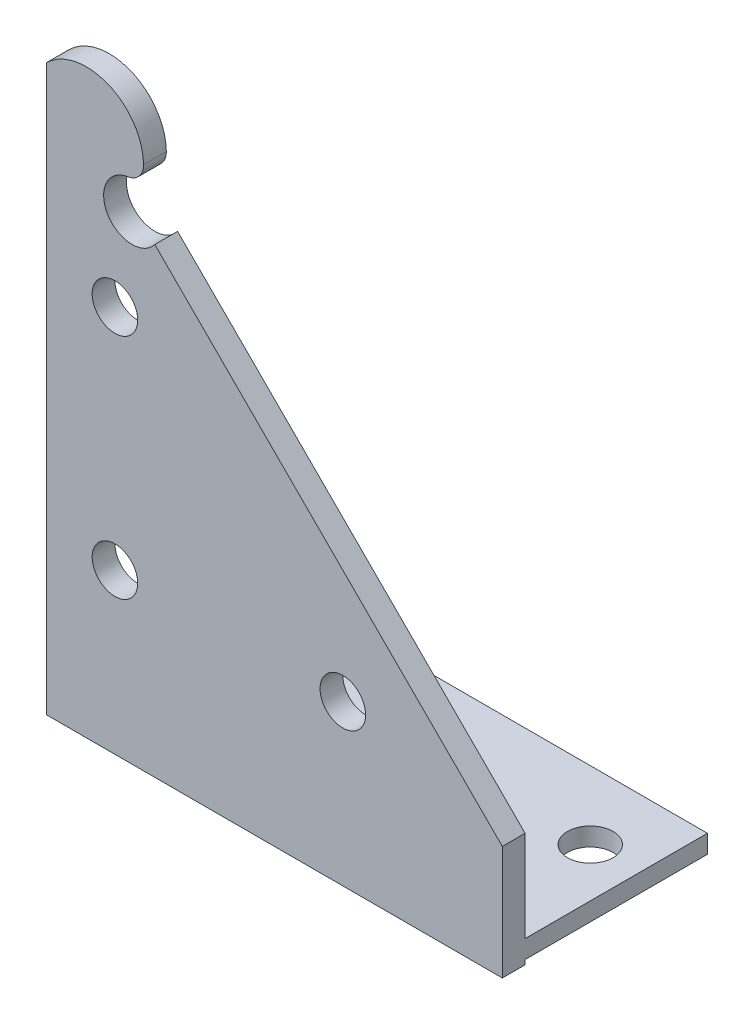
ISO-10303-21;
HEADER;
FILE_DESCRIPTION(('STEP AP214'),'2;1');
FILE_NAME('part.step','',(''),(''),'','','');
FILE_SCHEMA(('AUTOMOTIVE_DESIGN { 1 0 10303 214 1 1 1 1 }'));
ENDSEC;
DATA;
#1=APPLICATION_CONTEXT('core data for automotive mechanical design processes');
#2=APPLICATION_PROTOCOL_DEFINITION('international standard','automotive_design',2000,#1);
#3=PRODUCT_CONTEXT('',#1,'mechanical');
#4=PRODUCT('Part','Part','',(#3));
#5=PRODUCT_RELATED_PRODUCT_CATEGORY('part','',(#4));
#6=PRODUCT_DEFINITION_FORMATION('','',#4);
#7=PRODUCT_DEFINITION_CONTEXT('part definition',#1,'design');
#8=PRODUCT_DEFINITION('design','',#6,#7);
#9=PRODUCT_DEFINITION_SHAPE('','',#8);
#10=(LENGTH_UNIT() NAMED_UNIT(*) SI_UNIT(.MILLI.,.METRE.));
#11=(NAMED_UNIT(*) PLANE_ANGLE_UNIT() SI_UNIT($,.RADIAN.));
#12=(NAMED_UNIT(*) SI_UNIT($,.STERADIAN.) SOLID_ANGLE_UNIT());
#13=UNCERTAINTY_MEASURE_WITH_UNIT(LENGTH_MEASURE(1.E-05),#10,'distance_accuracy_value','');
#14=(GEOMETRIC_REPRESENTATION_CONTEXT(3) GLOBAL_UNCERTAINTY_ASSIGNED_CONTEXT((#13)) GLOBAL_UNIT_ASSIGNED_CONTEXT((#10,
#11,#12)) REPRESENTATION_CONTEXT('',''));
#15=CARTESIAN_POINT('',(0.,0.,0.));
#16=DIRECTION('',(0.,0.,1.));
#17=DIRECTION('',(1.,0.,0.));
#18=AXIS2_PLACEMENT_3D('',#15,#16,#17);
#19=CARTESIAN_POINT('',(11.9126,66.675,0.));
#20=DIRECTION('',(0.,0.,1.));
#21=DIRECTION('',(1.,0.,0.));
#22=AXIS2_PLACEMENT_3D('',#19,#20,#21);
#23=PLANE('',#22);
#24=DIRECTION('',(-1.,0.,0.));
#25=VECTOR('',#24,1.);
#26=CARTESIAN_POINT('',(63.5,0.635,0.));
#27=LINE('',#26,#25);
#28=CARTESIAN_POINT('',(63.5,0.635,0.));
#29=VERTEX_POINT('',#28);
#30=CARTESIAN_POINT('',(0.,0.634999999999997,0.));
#31=VERTEX_POINT('',#30);
#32=EDGE_CURVE('E195',#29,#31,#27,.T.);
#33=ORIENTED_EDGE('',*,*,#32,.F.);
#34=DIRECTION('',(0.,1.,0.));
#35=VECTOR('',#34,1.);
#36=CARTESIAN_POINT('',(63.5,0.,0.));
#37=LINE('',#36,#35);
#38=CARTESIAN_POINT('',(63.5,0.,0.));
#39=VERTEX_POINT('',#38);
#40=EDGE_CURVE('E157',#39,#29,#37,.T.);
#41=ORIENTED_EDGE('',*,*,#40,.F.);
#42=DIRECTION('',(1.,0.,0.));
#43=VECTOR('',#42,1.);
#44=CARTESIAN_POINT('',(0.,0.,0.));
#45=LINE('',#44,#43);
#46=CARTESIAN_POINT('',(0.,0.,0.));
#47=VERTEX_POINT('',#46);
#48=EDGE_CURVE('E152',#47,#39,#45,.T.);
#49=ORIENTED_EDGE('',*,*,#48,.F.);
#50=DIRECTION('',(0.,-1.,0.));
#51=VECTOR('',#50,1.);
#52=CARTESIAN_POINT('',(0.,78.7050670136892,0.));
#53=LINE('',#52,#51);
#54=EDGE_CURVE('E153',#31,#47,#53,.T.);
#55=ORIENTED_EDGE('',*,*,#54,.F.);
#56=EDGE_LOOP('',(#33,#41,#49,#55));
#57=FACE_BOUND('',#56,.T.);
#58=ADVANCED_FACE('F39',(#57),#23,.F.);
#59=CARTESIAN_POINT('',(11.9126,66.675,3.175));
#60=DIRECTION('',(0.,0.,1.));
#61=DIRECTION('',(1.,0.,0.));
#62=AXIS2_PLACEMENT_3D('',#59,#60,#61);
#63=PLANE('',#62);
#64=CARTESIAN_POINT('',(9.525,53.975,3.175));
#65=DIRECTION('',(0.,0.,1.));
#66=DIRECTION('',(1.,0.,0.));
#67=AXIS2_PLACEMENT_3D('',#64,#65,#66);
#68=CIRCLE('',#67,3.175);
#69=CARTESIAN_POINT('',(12.7,53.975,3.175));
#70=VERTEX_POINT('',#69);
#71=EDGE_CURVE('E239',#70,#70,#68,.T.);
#72=ORIENTED_EDGE('',*,*,#71,.F.);
#73=EDGE_LOOP('',(#72));
#74=FACE_BOUND('',#73,.T.);
#75=DIRECTION('',(0.,-1.,0.));
#76=VECTOR('',#75,1.);
#77=CARTESIAN_POINT('',(0.,78.7050670136892,3.175));
#78=LINE('',#77,#76);
#79=CARTESIAN_POINT('',(0.,78.7050670136892,3.175));
#80=VERTEX_POINT('',#79);
#81=CARTESIAN_POINT('',(0.,0.,3.175));
#82=VERTEX_POINT('',#81);
#83=EDGE_CURVE('E171',#80,#82,#78,.T.);
#84=ORIENTED_EDGE('',*,*,#83,.T.);
#85=DIRECTION('',(1.,0.,0.));
#86=VECTOR('',#85,1.);
#87=CARTESIAN_POINT('',(0.,0.,3.175));
#88=LINE('',#87,#86);
#89=CARTESIAN_POINT('',(63.5,0.,3.175));
#90=VERTEX_POINT('',#89);
#91=EDGE_CURVE('E102',#82,#90,#88,.T.);
#92=ORIENTED_EDGE('',*,*,#91,.T.);
#93=DIRECTION('',(0.,1.,0.));
#94=VECTOR('',#93,1.);
#95=CARTESIAN_POINT('',(63.5,0.,3.175));
#96=LINE('',#95,#94);
#97=CARTESIAN_POINT('',(63.5,15.875,3.175));
#98=VERTEX_POINT('',#97);
#99=EDGE_CURVE('E189',#90,#98,#96,.T.);
#100=ORIENTED_EDGE('',*,*,#99,.T.);
#101=DIRECTION('',(-0.707106781186549,0.707106781186546,0.));
#102=VECTOR('',#101,1.);
#103=CARTESIAN_POINT('',(63.5,15.875,3.175));
#104=LINE('',#103,#102);
#105=CARTESIAN_POINT('',(15.0803416705593,64.2946583294405,3.175));
#106=VERTEX_POINT('',#105);
#107=EDGE_CURVE('E123',#98,#106,#104,.T.);
#108=ORIENTED_EDGE('',*,*,#107,.T.);
#109=CARTESIAN_POINT('',(11.9126,66.675,3.175));
#110=DIRECTION('',(0.,0.,-1.));
#111=DIRECTION('',(1.,0.,0.));
#112=AXIS2_PLACEMENT_3D('',#109,#110,#111);
#113=CIRCLE('',#112,3.9624);
#114=CARTESIAN_POINT('',(11.3395116834637,70.5957376272138,3.175));
#115=VERTEX_POINT('',#114);
#116=EDGE_CURVE('E115',#106,#115,#113,.T.);
#117=ORIENTED_EDGE('',*,*,#116,.T.);
#118=CARTESIAN_POINT('',(10.9721473779918,73.1090309779918,3.175));
#119=DIRECTION('',(0.,0.,1.));
#120=DIRECTION('',(-1.,0.,0.));
#121=AXIS2_PLACEMENT_3D('',#118,#119,#120);
#122=CIRCLE('',#121,2.54);
#123=CARTESIAN_POINT('',(13.5118409826828,73.1484821413682,3.175));
#124=VERTEX_POINT('',#123);
#125=EDGE_CURVE('E120',#115,#124,#122,.T.);
#126=ORIENTED_EDGE('',*,*,#125,.T.);
#127=CARTESIAN_POINT('',(5.5626,73.025,3.175));
#128=DIRECTION('',(0.,0.,1.));
#129=DIRECTION('',(-1.,0.,0.));
#130=AXIS2_PLACEMENT_3D('',#127,#128,#129);
#131=CIRCLE('',#130,7.9502);
#132=EDGE_CURVE('E64',#124,#80,#131,.T.);
#133=ORIENTED_EDGE('',*,*,#132,.T.);
#134=EDGE_LOOP('',(#84,#92,#100,#108,#117,#126,#133));
#135=FACE_BOUND('',#134,.T.);
#136=CARTESIAN_POINT('',(9.525,22.225,3.175));
#137=DIRECTION('',(0.,0.,1.));
#138=DIRECTION('',(1.,0.,0.));
#139=AXIS2_PLACEMENT_3D('',#136,#137,#138);
#140=CIRCLE('',#139,3.175);
#141=CARTESIAN_POINT('',(12.7,22.225,3.175));
#142=VERTEX_POINT('',#141);
#143=EDGE_CURVE('E247',#142,#142,#140,.T.);
#144=ORIENTED_EDGE('',*,*,#143,.F.);
#145=EDGE_LOOP('',(#144));
#146=FACE_BOUND('',#145,.T.);
#147=CARTESIAN_POINT('',(41.275,22.225,3.175));
#148=DIRECTION('',(0.,0.,1.));
#149=DIRECTION('',(1.,0.,0.));
#150=AXIS2_PLACEMENT_3D('',#147,#148,#149);
#151=CIRCLE('',#150,3.175);
#152=CARTESIAN_POINT('',(44.45,22.225,3.175));
#153=VERTEX_POINT('',#152);
#154=EDGE_CURVE('E231',#153,#153,#151,.T.);
#155=ORIENTED_EDGE('',*,*,#154,.F.);
#156=EDGE_LOOP('',(#155));
#157=FACE_BOUND('',#156,.T.);
#158=ADVANCED_FACE('F117',(#74,#135,#146,#157),#63,.T.);
#159=CARTESIAN_POINT('',(63.5,3.175,0.));
#160=VERTEX_POINT('',#159);
#161=CARTESIAN_POINT('',(63.5,15.875,0.));
#162=VERTEX_POINT('',#161);
#163=EDGE_CURVE('E156',#160,#162,#37,.T.);
#164=ORIENTED_EDGE('',*,*,#163,.F.);
#165=DIRECTION('',(-1.,0.,0.));
#166=VECTOR('',#165,1.);
#167=CARTESIAN_POINT('',(63.5,3.175,0.));
#168=LINE('',#167,#166);
#169=CARTESIAN_POINT('',(0.,3.175,0.));
#170=VERTEX_POINT('',#169);
#171=EDGE_CURVE('E203',#160,#170,#168,.T.);
#172=ORIENTED_EDGE('',*,*,#171,.T.);
#173=CARTESIAN_POINT('',(0.,78.7050670136892,0.));
#174=VERTEX_POINT('',#173);
#175=EDGE_CURVE('E148',#174,#170,#53,.T.);
#176=ORIENTED_EDGE('',*,*,#175,.F.);
#177=CARTESIAN_POINT('',(5.5626,73.025,0.));
#178=DIRECTION('',(0.,0.,1.));
#179=DIRECTION('',(-1.,0.,0.));
#180=AXIS2_PLACEMENT_3D('',#177,#178,#179);
#181=CIRCLE('',#180,7.9502);
#182=CARTESIAN_POINT('',(13.5118409826828,73.1484821413682,0.));
#183=VERTEX_POINT('',#182);
#184=EDGE_CURVE('E94',#183,#174,#181,.T.);
#185=ORIENTED_EDGE('',*,*,#184,.F.);
#186=CARTESIAN_POINT('',(10.9721473779918,73.1090309779918,0.));
#187=DIRECTION('',(0.,0.,1.));
#188=DIRECTION('',(-1.,0.,0.));
#189=AXIS2_PLACEMENT_3D('',#186,#187,#188);
#190=CIRCLE('',#189,2.54);
#191=CARTESIAN_POINT('',(11.3395116834637,70.5957376272138,0.));
#192=VERTEX_POINT('',#191);
#193=EDGE_CURVE('E166',#192,#183,#190,.T.);
#194=ORIENTED_EDGE('',*,*,#193,.F.);
#195=CARTESIAN_POINT('',(11.9126,66.675,0.));
#196=DIRECTION('',(0.,0.,-1.));
#197=DIRECTION('',(1.,0.,0.));
#198=AXIS2_PLACEMENT_3D('',#195,#196,#197);
#199=CIRCLE('',#198,3.9624);
#200=CARTESIAN_POINT('',(15.0803416705593,64.2946583294405,0.));
#201=VERTEX_POINT('',#200);
#202=EDGE_CURVE('E133',#201,#192,#199,.T.);
#203=ORIENTED_EDGE('',*,*,#202,.F.);
#204=DIRECTION('',(-0.707106781186549,0.707106781186546,0.));
#205=VECTOR('',#204,1.);
#206=CARTESIAN_POINT('',(63.5,15.875,0.));
#207=LINE('',#206,#205);
#208=EDGE_CURVE('E161',#162,#201,#207,.T.);
#209=ORIENTED_EDGE('',*,*,#208,.F.);
#210=EDGE_LOOP('',(#164,#172,#176,#185,#194,#203,#209));
#211=FACE_BOUND('',#210,.T.);
#212=CARTESIAN_POINT('',(9.525,22.225,0.));
#213=DIRECTION('',(0.,0.,1.));
#214=DIRECTION('',(1.,0.,0.));
#215=AXIS2_PLACEMENT_3D('',#212,#213,#214);
#216=CIRCLE('',#215,3.175);
#217=CARTESIAN_POINT('',(12.7,22.225,0.));
#218=VERTEX_POINT('',#217);
#219=EDGE_CURVE('E243',#218,#218,#216,.T.);
#220=ORIENTED_EDGE('',*,*,#219,.T.);
#221=EDGE_LOOP('',(#220));
#222=FACE_BOUND('',#221,.T.);
#223=CARTESIAN_POINT('',(9.525,53.975,0.));
#224=DIRECTION('',(0.,0.,1.));
#225=DIRECTION('',(1.,0.,0.));
#226=AXIS2_PLACEMENT_3D('',#223,#224,#225);
#227=CIRCLE('',#226,3.175);
#228=CARTESIAN_POINT('',(12.7,53.975,0.));
#229=VERTEX_POINT('',#228);
#230=EDGE_CURVE('E235',#229,#229,#227,.T.);
#231=ORIENTED_EDGE('',*,*,#230,.T.);
#232=EDGE_LOOP('',(#231));
#233=FACE_BOUND('',#232,.T.);
#234=CARTESIAN_POINT('',(41.275,22.225,0.));
#235=DIRECTION('',(0.,0.,1.));
#236=DIRECTION('',(1.,0.,0.));
#237=AXIS2_PLACEMENT_3D('',#234,#235,#236);
#238=CIRCLE('',#237,3.175);
#239=CARTESIAN_POINT('',(44.45,22.225,0.));
#240=VERTEX_POINT('',#239);
#241=EDGE_CURVE('E230',#240,#240,#238,.T.);
#242=ORIENTED_EDGE('',*,*,#241,.T.);
#243=EDGE_LOOP('',(#242));
#244=FACE_BOUND('',#243,.T.);
#245=ADVANCED_FACE('F316',(#211,#222,#233,#244),#23,.F.);
#246=CARTESIAN_POINT('',(0.,78.7050670136892,3.175));
#247=DIRECTION('',(1.,0.,0.));
#248=DIRECTION('',(0.,0.,-1.));
#249=AXIS2_PLACEMENT_3D('',#246,#247,#248);
#250=PLANE('',#249);
#251=ORIENTED_EDGE('',*,*,#175,.T.);
#252=DIRECTION('',(0.,0.,1.));
#253=VECTOR('',#252,1.);
#254=CARTESIAN_POINT('',(0.,3.175,-25.4));
#255=LINE('',#254,#253);
#256=CARTESIAN_POINT('',(0.,3.175,-25.4));
#257=VERTEX_POINT('',#256);
#258=EDGE_CURVE('E55',#257,#170,#255,.T.);
#259=ORIENTED_EDGE('',*,*,#258,.F.);
#260=DIRECTION('',(0.,-1.,0.));
#261=VECTOR('',#260,1.);
#262=CARTESIAN_POINT('',(0.,3.175,-25.4));
#263=LINE('',#262,#261);
#264=CARTESIAN_POINT('',(0.,0.634999999999997,-25.4));
#265=VERTEX_POINT('',#264);
#266=EDGE_CURVE('E267',#257,#265,#263,.T.);
#267=ORIENTED_EDGE('',*,*,#266,.T.);
#268=DIRECTION('',(0.,0.,1.));
#269=VECTOR('',#268,1.);
#270=CARTESIAN_POINT('',(0.,0.634999999999997,-25.4));
#271=LINE('',#270,#269);
#272=EDGE_CURVE('E226',#265,#31,#271,.T.);
#273=ORIENTED_EDGE('',*,*,#272,.T.);
#274=ORIENTED_EDGE('',*,*,#54,.T.);
#275=DIRECTION('',(0.,0.,-1.));
#276=VECTOR('',#275,1.);
#277=CARTESIAN_POINT('',(0.,0.,3.175));
#278=LINE('',#277,#276);
#279=EDGE_CURVE('E11',#82,#47,#278,.T.);
#280=ORIENTED_EDGE('',*,*,#279,.F.);
#281=ORIENTED_EDGE('',*,*,#83,.F.);
#282=DIRECTION('',(0.,0.,-1.));
#283=VECTOR('',#282,1.);
#284=CARTESIAN_POINT('',(0.,78.7050670136892,3.175));
#285=LINE('',#284,#283);
#286=EDGE_CURVE('E144',#80,#174,#285,.T.);
#287=ORIENTED_EDGE('',*,*,#286,.T.);
#288=EDGE_LOOP('',(#251,#259,#267,#273,#274,#280,#281,#287));
#289=FACE_BOUND('',#288,.T.);
#290=ADVANCED_FACE('F41',(#289),#250,.F.);
#291=CARTESIAN_POINT('',(0.,0.,3.175));
#292=DIRECTION('',(0.,1.,0.));
#293=DIRECTION('',(0.,0.,1.));
#294=AXIS2_PLACEMENT_3D('',#291,#292,#293);
#295=PLANE('',#294);
#296=ORIENTED_EDGE('',*,*,#48,.T.);
#297=DIRECTION('',(0.,0.,-1.));
#298=VECTOR('',#297,1.);
#299=CARTESIAN_POINT('',(63.5,0.,3.175));
#300=LINE('',#299,#298);
#301=EDGE_CURVE('E48',#90,#39,#300,.T.);
#302=ORIENTED_EDGE('',*,*,#301,.F.);
#303=ORIENTED_EDGE('',*,*,#91,.F.);
#304=ORIENTED_EDGE('',*,*,#279,.T.);
#305=EDGE_LOOP('',(#296,#302,#303,#304));
#306=FACE_BOUND('',#305,.T.);
#307=ADVANCED_FACE('F324',(#306),#295,.F.);
#308=CARTESIAN_POINT('',(63.5,0.,3.175));
#309=DIRECTION('',(-1.,0.,0.));
#310=DIRECTION('',(0.,0.,1.));
#311=AXIS2_PLACEMENT_3D('',#308,#309,#310);
#312=PLANE('',#311);
#313=ORIENTED_EDGE('',*,*,#40,.T.);
#314=DIRECTION('',(0.,0.,1.));
#315=VECTOR('',#314,1.);
#316=CARTESIAN_POINT('',(63.5,0.635,-25.4));
#317=LINE('',#316,#315);
#318=CARTESIAN_POINT('',(63.5,0.635,-25.4));
#319=VERTEX_POINT('',#318);
#320=EDGE_CURVE('E217',#319,#29,#317,.T.);
#321=ORIENTED_EDGE('',*,*,#320,.F.);
#322=DIRECTION('',(0.,1.,0.));
#323=VECTOR('',#322,1.);
#324=CARTESIAN_POINT('',(63.5,0.635,-25.4));
#325=LINE('',#324,#323);
#326=CARTESIAN_POINT('',(63.5,3.175,-25.4));
#327=VERTEX_POINT('',#326);
#328=EDGE_CURVE('E214',#319,#327,#325,.T.);
#329=ORIENTED_EDGE('',*,*,#328,.T.);
#330=DIRECTION('',(0.,0.,1.));
#331=VECTOR('',#330,1.);
#332=CARTESIAN_POINT('',(63.5,3.175,-25.4));
#333=LINE('',#332,#331);
#334=EDGE_CURVE('E220',#327,#160,#333,.T.);
#335=ORIENTED_EDGE('',*,*,#334,.T.);
#336=ORIENTED_EDGE('',*,*,#163,.T.);
#337=DIRECTION('',(0.,0.,-1.));
#338=VECTOR('',#337,1.);
#339=CARTESIAN_POINT('',(63.5,15.875,3.175));
#340=LINE('',#339,#338);
#341=EDGE_CURVE('E178',#98,#162,#340,.T.);
#342=ORIENTED_EDGE('',*,*,#341,.F.);
#343=ORIENTED_EDGE('',*,*,#99,.F.);
#344=ORIENTED_EDGE('',*,*,#301,.T.);
#345=EDGE_LOOP('',(#313,#321,#329,#335,#336,#342,#343,#344));
#346=FACE_BOUND('',#345,.T.);
#347=ADVANCED_FACE('F186',(#346),#312,.F.);
#348=CARTESIAN_POINT('',(63.5,15.875,3.175));
#349=DIRECTION('',(-0.707106781186546,-0.707106781186549,0.));
#350=DIRECTION('',(0.707106781186549,-0.707106781186546,0.));
#351=AXIS2_PLACEMENT_3D('',#348,#349,#350);
#352=PLANE('',#351);
#353=ORIENTED_EDGE('',*,*,#208,.T.);
#354=DIRECTION('',(0.,0.,-1.));
#355=VECTOR('',#354,1.);
#356=CARTESIAN_POINT('',(15.0803416705593,64.2946583294405,3.175));
#357=LINE('',#356,#355);
#358=EDGE_CURVE('E137',#106,#201,#357,.T.);
#359=ORIENTED_EDGE('',*,*,#358,.F.);
#360=ORIENTED_EDGE('',*,*,#107,.F.);
#361=ORIENTED_EDGE('',*,*,#341,.T.);
#362=EDGE_LOOP('',(#353,#359,#360,#361));
#363=FACE_BOUND('',#362,.T.);
#364=ADVANCED_FACE('F319',(#363),#352,.F.);
#365=CARTESIAN_POINT('',(11.9126,66.675,3.175));
#366=DIRECTION('',(0.,0.,-1.));
#367=DIRECTION('',(-1.,0.,0.));
#368=AXIS2_PLACEMENT_3D('',#365,#366,#367);
#369=CYLINDRICAL_SURFACE('',#368,3.9624);
#370=ORIENTED_EDGE('',*,*,#202,.T.);
#371=DIRECTION('',(0.,0.,-1.));
#372=VECTOR('',#371,1.);
#373=CARTESIAN_POINT('',(11.3395116834637,70.5957376272138,3.175));
#374=LINE('',#373,#372);
#375=EDGE_CURVE('E130',#115,#192,#374,.T.);
#376=ORIENTED_EDGE('',*,*,#375,.F.);
#377=ORIENTED_EDGE('',*,*,#116,.F.);
#378=ORIENTED_EDGE('',*,*,#358,.T.);
#379=EDGE_LOOP('',(#370,#376,#377,#378));
#380=FACE_BOUND('',#379,.T.);
#381=ADVANCED_FACE('F131',(#380),#369,.F.);
#382=CARTESIAN_POINT('',(10.9721473779918,73.1090309779918,3.175));
#383=DIRECTION('',(0.,0.,-1.));
#384=DIRECTION('',(-1.,0.,0.));
#385=AXIS2_PLACEMENT_3D('',#382,#383,#384);
#386=CYLINDRICAL_SURFACE('',#385,2.54);
#387=ORIENTED_EDGE('',*,*,#193,.T.);
#388=DIRECTION('',(0.,0.,-1.));
#389=VECTOR('',#388,1.);
#390=CARTESIAN_POINT('',(13.5118409826828,73.1484821413682,3.175));
#391=LINE('',#390,#389);
#392=EDGE_CURVE('E138',#124,#183,#391,.T.);
#393=ORIENTED_EDGE('',*,*,#392,.F.);
#394=ORIENTED_EDGE('',*,*,#125,.F.);
#395=ORIENTED_EDGE('',*,*,#375,.T.);
#396=EDGE_LOOP('',(#387,#393,#394,#395));
#397=FACE_BOUND('',#396,.T.);
#398=ADVANCED_FACE('F140',(#397),#386,.T.);
#399=CARTESIAN_POINT('',(5.5626,73.025,3.175));
#400=DIRECTION('',(0.,0.,-1.));
#401=DIRECTION('',(-1.,0.,0.));
#402=AXIS2_PLACEMENT_3D('',#399,#400,#401);
#403=CYLINDRICAL_SURFACE('',#402,7.9502);
#404=ORIENTED_EDGE('',*,*,#184,.T.);
#405=ORIENTED_EDGE('',*,*,#286,.F.);
#406=ORIENTED_EDGE('',*,*,#132,.F.);
#407=ORIENTED_EDGE('',*,*,#392,.T.);
#408=EDGE_LOOP('',(#404,#405,#406,#407));
#409=FACE_BOUND('',#408,.T.);
#410=ADVANCED_FACE('F320',(#409),#403,.T.);
#411=CARTESIAN_POINT('',(9.525,22.225,3.175));
#412=DIRECTION('',(0.,0.,-1.));
#413=DIRECTION('',(-1.,0.,0.));
#414=AXIS2_PLACEMENT_3D('',#411,#412,#413);
#415=CYLINDRICAL_SURFACE('',#414,3.175);
#416=ORIENTED_EDGE('',*,*,#143,.T.);
#417=EDGE_LOOP('',(#416));
#418=FACE_BOUND('',#417,.T.);
#419=ORIENTED_EDGE('',*,*,#219,.F.);
#420=EDGE_LOOP('',(#419));
#421=FACE_BOUND('',#420,.T.);
#422=ADVANCED_FACE('F422',(#418,#421),#415,.F.);
#423=CARTESIAN_POINT('',(9.525,53.975,3.175));
#424=DIRECTION('',(0.,0.,-1.));
#425=DIRECTION('',(-1.,0.,0.));
#426=AXIS2_PLACEMENT_3D('',#423,#424,#425);
#427=CYLINDRICAL_SURFACE('',#426,3.175);
#428=ORIENTED_EDGE('',*,*,#71,.T.);
#429=EDGE_LOOP('',(#428));
#430=FACE_BOUND('',#429,.T.);
#431=ORIENTED_EDGE('',*,*,#230,.F.);
#432=EDGE_LOOP('',(#431));
#433=FACE_BOUND('',#432,.T.);
#434=ADVANCED_FACE('F418',(#430,#433),#427,.F.);
#435=CARTESIAN_POINT('',(41.275,22.225,3.175));
#436=DIRECTION('',(0.,0.,-1.));
#437=DIRECTION('',(-1.,0.,0.));
#438=AXIS2_PLACEMENT_3D('',#435,#436,#437);
#439=CYLINDRICAL_SURFACE('',#438,3.175);
#440=ORIENTED_EDGE('',*,*,#154,.T.);
#441=EDGE_LOOP('',(#440));
#442=FACE_BOUND('',#441,.T.);
#443=ORIENTED_EDGE('',*,*,#241,.F.);
#444=EDGE_LOOP('',(#443));
#445=FACE_BOUND('',#444,.T.);
#446=ADVANCED_FACE('F379',(#442,#445),#439,.F.);
#447=CARTESIAN_POINT('',(63.5,0.635,-25.4));
#448=DIRECTION('',(0.,1.,0.));
#449=DIRECTION('',(-1.,0.,0.));
#450=AXIS2_PLACEMENT_3D('',#447,#448,#449);
#451=PLANE('',#450);
#452=CARTESIAN_POINT('',(56.6993804446074,0.635,-15.875));
#453=DIRECTION('',(0.,1.,0.));
#454=DIRECTION('',(-1.,0.,0.));
#455=AXIS2_PLACEMENT_3D('',#452,#453,#454);
#456=CIRCLE('',#455,3.175);
#457=CARTESIAN_POINT('',(53.5243804446074,0.635,-15.875));
#458=VERTEX_POINT('',#457);
#459=EDGE_CURVE('E204',#458,#458,#456,.T.);
#460=ORIENTED_EDGE('',*,*,#459,.T.);
#461=EDGE_LOOP('',(#460));
#462=FACE_BOUND('',#461,.T.);
#463=CARTESIAN_POINT('',(9.525,0.634999999999997,-15.875));
#464=DIRECTION('',(0.,1.,0.));
#465=DIRECTION('',(-1.,0.,0.));
#466=AXIS2_PLACEMENT_3D('',#463,#464,#465);
#467=CIRCLE('',#466,3.175);
#468=CARTESIAN_POINT('',(6.35,0.634999999999997,-15.875));
#469=VERTEX_POINT('',#468);
#470=EDGE_CURVE('E211',#469,#469,#467,.T.);
#471=ORIENTED_EDGE('',*,*,#470,.T.);
#472=EDGE_LOOP('',(#471));
#473=FACE_BOUND('',#472,.T.);
#474=CARTESIAN_POINT('',(31.75,0.635,-12.7));
#475=DIRECTION('',(0.,1.,0.));
#476=DIRECTION('',(-1.,0.,0.));
#477=AXIS2_PLACEMENT_3D('',#474,#475,#476);
#478=CIRCLE('',#477,3.175);
#479=CARTESIAN_POINT('',(28.575,0.635,-12.7));
#480=VERTEX_POINT('',#479);
#481=EDGE_CURVE('E281',#480,#480,#478,.T.);
#482=ORIENTED_EDGE('',*,*,#481,.T.);
#483=EDGE_LOOP('',(#482));
#484=FACE_BOUND('',#483,.T.);
#485=ORIENTED_EDGE('',*,*,#32,.T.);
#486=ORIENTED_EDGE('',*,*,#272,.F.);
#487=DIRECTION('',(-1.,0.,0.));
#488=VECTOR('',#487,1.);
#489=CARTESIAN_POINT('',(63.5,0.635,-25.4));
#490=LINE('',#489,#488);
#491=EDGE_CURVE('E208',#319,#265,#490,.T.);
#492=ORIENTED_EDGE('',*,*,#491,.F.);
#493=ORIENTED_EDGE('',*,*,#320,.T.);
#494=EDGE_LOOP('',(#485,#486,#492,#493));
#495=FACE_BOUND('',#494,.T.);
#496=ADVANCED_FACE('F305',(#462,#473,#484,#495),#451,.F.);
#497=CARTESIAN_POINT('',(63.5,3.175,-25.4));
#498=DIRECTION('',(0.,1.,0.));
#499=DIRECTION('',(-1.,0.,0.));
#500=AXIS2_PLACEMENT_3D('',#497,#498,#499);
#501=PLANE('',#500);
#502=CARTESIAN_POINT('',(56.6993804446074,3.175,-15.875));
#503=DIRECTION('',(0.,1.,0.));
#504=DIRECTION('',(-1.,0.,0.));
#505=AXIS2_PLACEMENT_3D('',#502,#503,#504);
#506=CIRCLE('',#505,3.175);
#507=CARTESIAN_POINT('',(53.5243804446074,3.175,-15.875));
#508=VERTEX_POINT('',#507);
#509=EDGE_CURVE('E290',#508,#508,#506,.T.);
#510=ORIENTED_EDGE('',*,*,#509,.F.);
#511=EDGE_LOOP('',(#510));
#512=FACE_BOUND('',#511,.T.);
#513=CARTESIAN_POINT('',(9.525,3.175,-15.875));
#514=DIRECTION('',(0.,1.,0.));
#515=DIRECTION('',(-1.,0.,0.));
#516=AXIS2_PLACEMENT_3D('',#513,#514,#515);
#517=CIRCLE('',#516,3.175);
#518=CARTESIAN_POINT('',(6.35,3.175,-15.875));
#519=VERTEX_POINT('',#518);
#520=EDGE_CURVE('E289',#519,#519,#517,.T.);
#521=ORIENTED_EDGE('',*,*,#520,.F.);
#522=EDGE_LOOP('',(#521));
#523=FACE_BOUND('',#522,.T.);
#524=CARTESIAN_POINT('',(31.75,3.175,-12.7));
#525=DIRECTION('',(0.,1.,0.));
#526=DIRECTION('',(-1.,0.,0.));
#527=AXIS2_PLACEMENT_3D('',#524,#525,#526);
#528=CIRCLE('',#527,3.175);
#529=CARTESIAN_POINT('',(28.575,3.175,-12.7));
#530=VERTEX_POINT('',#529);
#531=EDGE_CURVE('E285',#530,#530,#528,.T.);
#532=ORIENTED_EDGE('',*,*,#531,.F.);
#533=EDGE_LOOP('',(#532));
#534=FACE_BOUND('',#533,.T.);
#535=ORIENTED_EDGE('',*,*,#171,.F.);
#536=ORIENTED_EDGE('',*,*,#334,.F.);
#537=DIRECTION('',(-1.,0.,0.));
#538=VECTOR('',#537,1.);
#539=CARTESIAN_POINT('',(63.5,3.175,-25.4));
#540=LINE('',#539,#538);
#541=EDGE_CURVE('E265',#327,#257,#540,.T.);
#542=ORIENTED_EDGE('',*,*,#541,.T.);
#543=ORIENTED_EDGE('',*,*,#258,.T.);
#544=EDGE_LOOP('',(#535,#536,#542,#543));
#545=FACE_BOUND('',#544,.T.);
#546=ADVANCED_FACE('F301',(#512,#523,#534,#545),#501,.T.);
#547=CARTESIAN_POINT('',(0.,0.,-25.4));
#548=DIRECTION('',(0.,0.,1.));
#549=DIRECTION('',(1.,0.,0.));
#550=AXIS2_PLACEMENT_3D('',#547,#548,#549);
#551=PLANE('',#550);
#552=ORIENTED_EDGE('',*,*,#491,.T.);
#553=ORIENTED_EDGE('',*,*,#266,.F.);
#554=ORIENTED_EDGE('',*,*,#541,.F.);
#555=ORIENTED_EDGE('',*,*,#328,.F.);
#556=EDGE_LOOP('',(#552,#553,#554,#555));
#557=FACE_BOUND('',#556,.T.);
#558=ADVANCED_FACE('F304',(#557),#551,.F.);
#559=CARTESIAN_POINT('',(31.75,-22.225,-12.7));
#560=DIRECTION('',(0.,1.,0.));
#561=DIRECTION('',(-1.,0.,0.));
#562=AXIS2_PLACEMENT_3D('',#559,#560,#561);
#563=CYLINDRICAL_SURFACE('',#562,3.175);
#564=ORIENTED_EDGE('',*,*,#531,.T.);
#565=EDGE_LOOP('',(#564));
#566=FACE_BOUND('',#565,.T.);
#567=ORIENTED_EDGE('',*,*,#481,.F.);
#568=EDGE_LOOP('',(#567));
#569=FACE_BOUND('',#568,.T.);
#570=ADVANCED_FACE('F368',(#566,#569),#563,.F.);
#571=CARTESIAN_POINT('',(9.525,-22.225,-15.875));
#572=DIRECTION('',(0.,1.,0.));
#573=DIRECTION('',(-1.,0.,0.));
#574=AXIS2_PLACEMENT_3D('',#571,#572,#573);
#575=CYLINDRICAL_SURFACE('',#574,3.175);
#576=ORIENTED_EDGE('',*,*,#520,.T.);
#577=EDGE_LOOP('',(#576));
#578=FACE_BOUND('',#577,.T.);
#579=ORIENTED_EDGE('',*,*,#470,.F.);
#580=EDGE_LOOP('',(#579));
#581=FACE_BOUND('',#580,.T.);
#582=ADVANCED_FACE('F298',(#578,#581),#575,.F.);
#583=CARTESIAN_POINT('',(56.6993804446074,-22.225,-15.875));
#584=DIRECTION('',(0.,1.,0.));
#585=DIRECTION('',(-1.,0.,0.));
#586=AXIS2_PLACEMENT_3D('',#583,#584,#585);
#587=CYLINDRICAL_SURFACE('',#586,3.175);
#588=ORIENTED_EDGE('',*,*,#509,.T.);
#589=EDGE_LOOP('',(#588));
#590=FACE_BOUND('',#589,.T.);
#591=ORIENTED_EDGE('',*,*,#459,.F.);
#592=EDGE_LOOP('',(#591));
#593=FACE_BOUND('',#592,.T.);
#594=ADVANCED_FACE('F402',(#590,#593),#587,.F.);
#595=CLOSED_SHELL('',(#58,#158,#245,#290,#307,#347,#364,#381,#398,#410,#422,#434,#446,#496,#546,
#558,#570,#582,#594));
#596=MANIFOLD_SOLID_BREP('B2',#595);
#597=ADVANCED_BREP_SHAPE_REPRESENTATION('',(#18,#596),#14);
#598=SHAPE_DEFINITION_REPRESENTATION(#9,#597);
ENDSEC;
END-ISO-10303-21;
